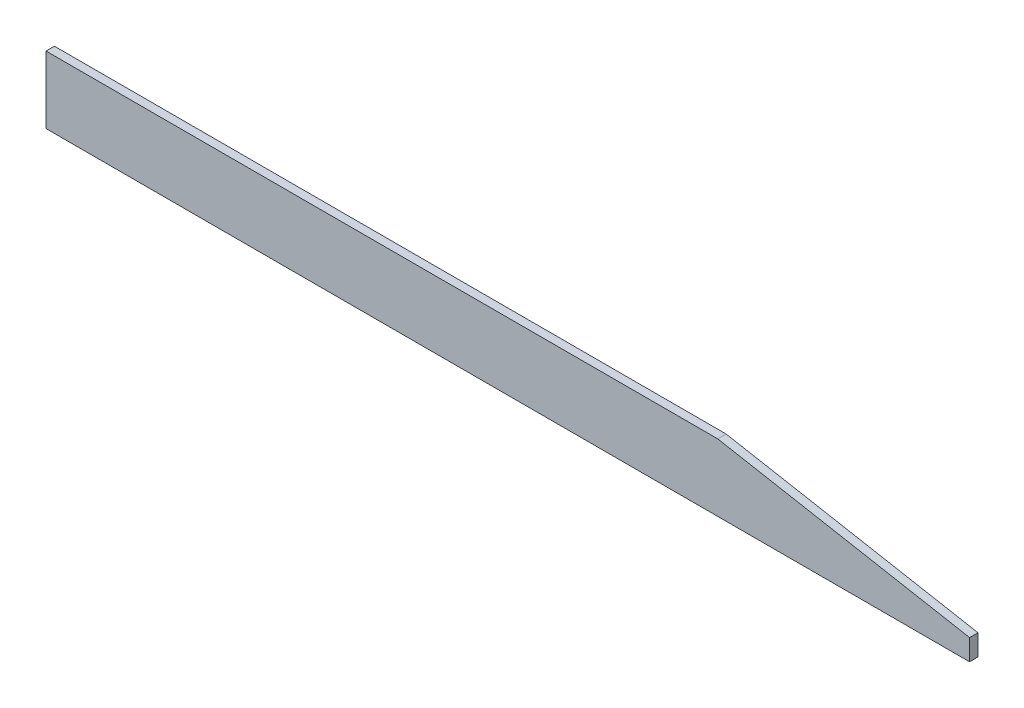
ISO-10303-21;
HEADER;
FILE_DESCRIPTION(('STEP AP214'),'2;1');
FILE_NAME('part.step','',(''),(''),'','','');
FILE_SCHEMA(('AUTOMOTIVE_DESIGN { 1 0 10303 214 1 1 1 1 }'));
ENDSEC;
DATA;
#1=APPLICATION_CONTEXT('core data for automotive mechanical design processes');
#2=APPLICATION_PROTOCOL_DEFINITION('international standard','automotive_design',2000,#1);
#3=PRODUCT_CONTEXT('',#1,'mechanical');
#4=PRODUCT('Part','Part','',(#3));
#5=PRODUCT_RELATED_PRODUCT_CATEGORY('part','',(#4));
#6=PRODUCT_DEFINITION_FORMATION('','',#4);
#7=PRODUCT_DEFINITION_CONTEXT('part definition',#1,'design');
#8=PRODUCT_DEFINITION('design','',#6,#7);
#9=PRODUCT_DEFINITION_SHAPE('','',#8);
#10=(LENGTH_UNIT() NAMED_UNIT(*) SI_UNIT(.MILLI.,.METRE.));
#11=(NAMED_UNIT(*) PLANE_ANGLE_UNIT() SI_UNIT($,.RADIAN.));
#12=(NAMED_UNIT(*) SI_UNIT($,.STERADIAN.) SOLID_ANGLE_UNIT());
#13=UNCERTAINTY_MEASURE_WITH_UNIT(LENGTH_MEASURE(1.E-05),#10,'distance_accuracy_value','');
#14=(GEOMETRIC_REPRESENTATION_CONTEXT(3) GLOBAL_UNCERTAINTY_ASSIGNED_CONTEXT((#13)) GLOBAL_UNIT_ASSIGNED_CONTEXT((#10,
#11,#12)) REPRESENTATION_CONTEXT('',''));
#15=CARTESIAN_POINT('',(0.,0.,0.));
#16=DIRECTION('',(0.,0.,1.));
#17=DIRECTION('',(1.,0.,0.));
#18=AXIS2_PLACEMENT_3D('',#15,#16,#17);
#19=CARTESIAN_POINT('',(0.,0.,2.));
#20=DIRECTION('',(1.,0.,0.));
#21=DIRECTION('',(0.,0.,-1.));
#22=AXIS2_PLACEMENT_3D('',#19,#20,#21);
#23=PLANE('',#22);
#24=DIRECTION('',(0.,-1.,0.));
#25=VECTOR('',#24,1.);
#26=CARTESIAN_POINT('',(0.,0.,0.));
#27=LINE('',#26,#25);
#28=CARTESIAN_POINT('',(0.,16.,0.));
#29=VERTEX_POINT('',#28);
#30=CARTESIAN_POINT('',(0.,0.,0.));
#31=VERTEX_POINT('',#30);
#32=EDGE_CURVE('E107',#29,#31,#27,.T.);
#33=ORIENTED_EDGE('',*,*,#32,.T.);
#34=DIRECTION('',(0.,0.,-1.));
#35=VECTOR('',#34,1.);
#36=CARTESIAN_POINT('',(0.,0.,2.));
#37=LINE('',#36,#35);
#38=CARTESIAN_POINT('',(0.,0.,2.));
#39=VERTEX_POINT('',#38);
#40=EDGE_CURVE('E11',#39,#31,#37,.T.);
#41=ORIENTED_EDGE('',*,*,#40,.F.);
#42=DIRECTION('',(0.,-1.,0.));
#43=VECTOR('',#42,1.);
#44=CARTESIAN_POINT('',(0.,0.,2.));
#45=LINE('',#44,#43);
#46=CARTESIAN_POINT('',(0.,16.,2.));
#47=VERTEX_POINT('',#46);
#48=EDGE_CURVE('E115',#47,#39,#45,.T.);
#49=ORIENTED_EDGE('',*,*,#48,.F.);
#50=DIRECTION('',(0.,0.,-1.));
#51=VECTOR('',#50,1.);
#52=CARTESIAN_POINT('',(0.,16.,2.));
#53=LINE('',#52,#51);
#54=EDGE_CURVE('E103',#47,#29,#53,.T.);
#55=ORIENTED_EDGE('',*,*,#54,.T.);
#56=EDGE_LOOP('',(#33,#41,#49,#55));
#57=FACE_BOUND('',#56,.T.);
#58=ADVANCED_FACE('F33',(#57),#23,.F.);
#59=CARTESIAN_POINT('',(0.,0.,2.));
#60=DIRECTION('',(0.,1.,0.));
#61=DIRECTION('',(0.,0.,1.));
#62=AXIS2_PLACEMENT_3D('',#59,#60,#61);
#63=PLANE('',#62);
#64=DIRECTION('',(1.,0.,0.));
#65=VECTOR('',#64,1.);
#66=CARTESIAN_POINT('',(0.,0.,0.));
#67=LINE('',#66,#65);
#68=CARTESIAN_POINT('',(220.,0.,0.));
#69=VERTEX_POINT('',#68);
#70=EDGE_CURVE('E110',#31,#69,#67,.T.);
#71=ORIENTED_EDGE('',*,*,#70,.T.);
#72=DIRECTION('',(0.,0.,-1.));
#73=VECTOR('',#72,1.);
#74=CARTESIAN_POINT('',(220.,0.,2.));
#75=LINE('',#74,#73);
#76=CARTESIAN_POINT('',(220.,0.,2.));
#77=VERTEX_POINT('',#76);
#78=EDGE_CURVE('E41',#77,#69,#75,.T.);
#79=ORIENTED_EDGE('',*,*,#78,.F.);
#80=DIRECTION('',(1.,0.,0.));
#81=VECTOR('',#80,1.);
#82=CARTESIAN_POINT('',(0.,0.,2.));
#83=LINE('',#82,#81);
#84=EDGE_CURVE('E83',#39,#77,#83,.T.);
#85=ORIENTED_EDGE('',*,*,#84,.F.);
#86=ORIENTED_EDGE('',*,*,#40,.T.);
#87=EDGE_LOOP('',(#71,#79,#85,#86));
#88=FACE_BOUND('',#87,.T.);
#89=ADVANCED_FACE('F134',(#88),#63,.F.);
#90=CARTESIAN_POINT('',(220.,5.,2.));
#91=DIRECTION('',(-1.,0.,0.));
#92=DIRECTION('',(0.,0.,1.));
#93=AXIS2_PLACEMENT_3D('',#90,#91,#92);
#94=PLANE('',#93);
#95=DIRECTION('',(0.,1.,0.));
#96=VECTOR('',#95,1.);
#97=CARTESIAN_POINT('',(220.,5.,0.));
#98=LINE('',#97,#96);
#99=CARTESIAN_POINT('',(220.,5.,0.));
#100=VERTEX_POINT('',#99);
#101=EDGE_CURVE('E98',#69,#100,#98,.T.);
#102=ORIENTED_EDGE('',*,*,#101,.T.);
#103=DIRECTION('',(0.,0.,-1.));
#104=VECTOR('',#103,1.);
#105=CARTESIAN_POINT('',(220.,5.,2.));
#106=LINE('',#105,#104);
#107=CARTESIAN_POINT('',(220.,5.,2.));
#108=VERTEX_POINT('',#107);
#109=EDGE_CURVE('E95',#108,#100,#106,.T.);
#110=ORIENTED_EDGE('',*,*,#109,.F.);
#111=DIRECTION('',(0.,1.,0.));
#112=VECTOR('',#111,1.);
#113=CARTESIAN_POINT('',(220.,5.,2.));
#114=LINE('',#113,#112);
#115=EDGE_CURVE('E87',#77,#108,#114,.T.);
#116=ORIENTED_EDGE('',*,*,#115,.F.);
#117=ORIENTED_EDGE('',*,*,#78,.T.);
#118=EDGE_LOOP('',(#102,#110,#116,#117));
#119=FACE_BOUND('',#118,.T.);
#120=ADVANCED_FACE('F96',(#119),#94,.F.);
#121=CARTESIAN_POINT('',(160.,16.,2.));
#122=DIRECTION('',(-0.180327868852459,-0.983606557377049,0.));
#123=DIRECTION('',(0.983606557377049,-0.180327868852459,0.));
#124=AXIS2_PLACEMENT_3D('',#121,#122,#123);
#125=PLANE('',#124);
#126=DIRECTION('',(-0.983606557377049,0.180327868852459,0.));
#127=VECTOR('',#126,1.);
#128=CARTESIAN_POINT('',(160.,16.,0.));
#129=LINE('',#128,#127);
#130=CARTESIAN_POINT('',(160.,16.,0.));
#131=VERTEX_POINT('',#130);
#132=EDGE_CURVE('E69',#100,#131,#129,.T.);
#133=ORIENTED_EDGE('',*,*,#132,.T.);
#134=DIRECTION('',(0.,0.,-1.));
#135=VECTOR('',#134,1.);
#136=CARTESIAN_POINT('',(160.,16.,2.));
#137=LINE('',#136,#135);
#138=CARTESIAN_POINT('',(160.,16.,2.));
#139=VERTEX_POINT('',#138);
#140=EDGE_CURVE('E99',#139,#131,#137,.T.);
#141=ORIENTED_EDGE('',*,*,#140,.F.);
#142=DIRECTION('',(-0.983606557377049,0.180327868852459,0.));
#143=VECTOR('',#142,1.);
#144=CARTESIAN_POINT('',(160.,16.,2.));
#145=LINE('',#144,#143);
#146=EDGE_CURVE('E91',#108,#139,#145,.T.);
#147=ORIENTED_EDGE('',*,*,#146,.F.);
#148=ORIENTED_EDGE('',*,*,#109,.T.);
#149=EDGE_LOOP('',(#133,#141,#147,#148));
#150=FACE_BOUND('',#149,.T.);
#151=ADVANCED_FACE('F101',(#150),#125,.F.);
#152=CARTESIAN_POINT('',(0.,16.,2.));
#153=DIRECTION('',(0.,-1.,0.));
#154=DIRECTION('',(0.,0.,-1.));
#155=AXIS2_PLACEMENT_3D('',#152,#153,#154);
#156=PLANE('',#155);
#157=DIRECTION('',(-1.,0.,0.));
#158=VECTOR('',#157,1.);
#159=CARTESIAN_POINT('',(0.,16.,0.));
#160=LINE('',#159,#158);
#161=EDGE_CURVE('E75',#131,#29,#160,.T.);
#162=ORIENTED_EDGE('',*,*,#161,.T.);
#163=ORIENTED_EDGE('',*,*,#54,.F.);
#164=DIRECTION('',(-1.,0.,0.));
#165=VECTOR('',#164,1.);
#166=CARTESIAN_POINT('',(0.,16.,2.));
#167=LINE('',#166,#165);
#168=EDGE_CURVE('E49',#139,#47,#167,.T.);
#169=ORIENTED_EDGE('',*,*,#168,.F.);
#170=ORIENTED_EDGE('',*,*,#140,.T.);
#171=EDGE_LOOP('',(#162,#163,#169,#170));
#172=FACE_BOUND('',#171,.T.);
#173=ADVANCED_FACE('F123',(#172),#156,.F.);
#174=CARTESIAN_POINT('',(0.,0.,2.));
#175=DIRECTION('',(0.,0.,-1.));
#176=DIRECTION('',(-1.,0.,0.));
#177=AXIS2_PLACEMENT_3D('',#174,#175,#176);
#178=PLANE('',#177);
#179=ORIENTED_EDGE('',*,*,#48,.T.);
#180=ORIENTED_EDGE('',*,*,#84,.T.);
#181=ORIENTED_EDGE('',*,*,#115,.T.);
#182=ORIENTED_EDGE('',*,*,#146,.T.);
#183=ORIENTED_EDGE('',*,*,#168,.T.);
#184=EDGE_LOOP('',(#179,#180,#181,#182,#183));
#185=FACE_BOUND('',#184,.T.);
#186=ADVANCED_FACE('F89',(#185),#178,.F.);
#187=CARTESIAN_POINT('',(0.,0.,0.));
#188=DIRECTION('',(0.,0.,-1.));
#189=DIRECTION('',(-1.,0.,0.));
#190=AXIS2_PLACEMENT_3D('',#187,#188,#189);
#191=PLANE('',#190);
#192=ORIENTED_EDGE('',*,*,#32,.F.);
#193=ORIENTED_EDGE('',*,*,#161,.F.);
#194=ORIENTED_EDGE('',*,*,#132,.F.);
#195=ORIENTED_EDGE('',*,*,#101,.F.);
#196=ORIENTED_EDGE('',*,*,#70,.F.);
#197=EDGE_LOOP('',(#192,#193,#194,#195,#196));
#198=FACE_BOUND('',#197,.T.);
#199=ADVANCED_FACE('F119',(#198),#191,.T.);
#200=CLOSED_SHELL('',(#58,#89,#120,#151,#173,#186,#199));
#201=MANIFOLD_SOLID_BREP('B2',#200);
#202=ADVANCED_BREP_SHAPE_REPRESENTATION('',(#18,#201),#14);
#203=SHAPE_DEFINITION_REPRESENTATION(#9,#202);
ENDSEC;
END-ISO-10303-21;
